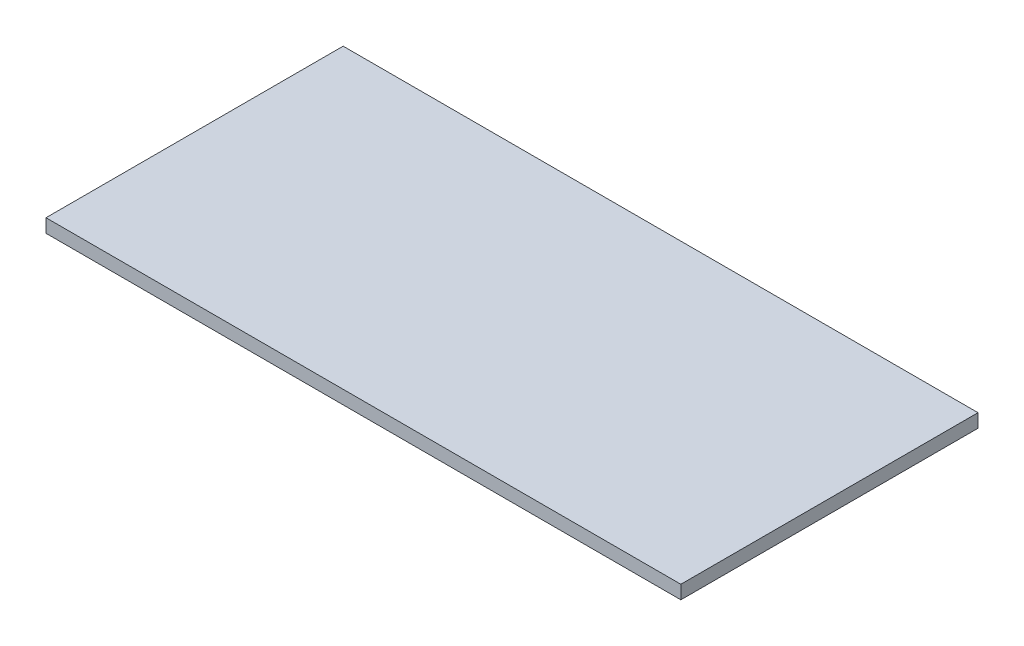
ISO-10303-21;
HEADER;
FILE_DESCRIPTION(('STEP AP214'),'2;1');
FILE_NAME('part.step','',(''),(''),'','','');
FILE_SCHEMA(('AUTOMOTIVE_DESIGN { 1 0 10303 214 1 1 1 1 }'));
ENDSEC;
DATA;
#1=APPLICATION_CONTEXT('core data for automotive mechanical design processes');
#2=APPLICATION_PROTOCOL_DEFINITION('international standard','automotive_design',2000,#1);
#3=PRODUCT_CONTEXT('',#1,'mechanical');
#4=PRODUCT('Part','Part','',(#3));
#5=PRODUCT_RELATED_PRODUCT_CATEGORY('part','',(#4));
#6=PRODUCT_DEFINITION_FORMATION('','',#4);
#7=PRODUCT_DEFINITION_CONTEXT('part definition',#1,'design');
#8=PRODUCT_DEFINITION('design','',#6,#7);
#9=PRODUCT_DEFINITION_SHAPE('','',#8);
#10=(LENGTH_UNIT() NAMED_UNIT(*) SI_UNIT(.MILLI.,.METRE.));
#11=(NAMED_UNIT(*) PLANE_ANGLE_UNIT() SI_UNIT($,.RADIAN.));
#12=(NAMED_UNIT(*) SI_UNIT($,.STERADIAN.) SOLID_ANGLE_UNIT());
#13=UNCERTAINTY_MEASURE_WITH_UNIT(LENGTH_MEASURE(1.E-05),#10,'distance_accuracy_value','');
#14=(GEOMETRIC_REPRESENTATION_CONTEXT(3) GLOBAL_UNCERTAINTY_ASSIGNED_CONTEXT((#13)) GLOBAL_UNIT_ASSIGNED_CONTEXT((#10,
#11,#12)) REPRESENTATION_CONTEXT('',''));
#15=CARTESIAN_POINT('',(0.,0.,0.));
#16=DIRECTION('',(0.,0.,1.));
#17=DIRECTION('',(1.,0.,0.));
#18=AXIS2_PLACEMENT_3D('',#15,#16,#17);
#19=CARTESIAN_POINT('',(70.5,3.,33.));
#20=DIRECTION('',(-1.,0.,0.));
#21=DIRECTION('',(0.,0.,1.));
#22=AXIS2_PLACEMENT_3D('',#19,#20,#21);
#23=PLANE('',#22);
#24=DIRECTION('',(0.,0.,-1.));
#25=VECTOR('',#24,1.);
#26=CARTESIAN_POINT('',(70.5,0.,33.));
#27=LINE('',#26,#25);
#28=CARTESIAN_POINT('',(70.5,0.,33.));
#29=VERTEX_POINT('',#28);
#30=CARTESIAN_POINT('',(70.5,0.,-33.));
#31=VERTEX_POINT('',#30);
#32=EDGE_CURVE('E97',#29,#31,#27,.T.);
#33=ORIENTED_EDGE('',*,*,#32,.T.);
#34=DIRECTION('',(0.,-1.,0.));
#35=VECTOR('',#34,1.);
#36=CARTESIAN_POINT('',(70.5,3.,-33.));
#37=LINE('',#36,#35);
#38=CARTESIAN_POINT('',(70.5,3.,-33.));
#39=VERTEX_POINT('',#38);
#40=EDGE_CURVE('E11',#39,#31,#37,.T.);
#41=ORIENTED_EDGE('',*,*,#40,.F.);
#42=DIRECTION('',(0.,0.,-1.));
#43=VECTOR('',#42,1.);
#44=CARTESIAN_POINT('',(70.5,3.,33.));
#45=LINE('',#44,#43);
#46=CARTESIAN_POINT('',(70.5,3.,33.));
#47=VERTEX_POINT('',#46);
#48=EDGE_CURVE('E85',#47,#39,#45,.T.);
#49=ORIENTED_EDGE('',*,*,#48,.F.);
#50=DIRECTION('',(0.,-1.,0.));
#51=VECTOR('',#50,1.);
#52=CARTESIAN_POINT('',(70.5,3.,33.));
#53=LINE('',#52,#51);
#54=EDGE_CURVE('E93',#47,#29,#53,.T.);
#55=ORIENTED_EDGE('',*,*,#54,.T.);
#56=EDGE_LOOP('',(#33,#41,#49,#55));
#57=FACE_BOUND('',#56,.T.);
#58=ADVANCED_FACE('F34',(#57),#23,.F.);
#59=CARTESIAN_POINT('',(-70.5,3.,-33.));
#60=DIRECTION('',(0.,0.,1.));
#61=DIRECTION('',(1.,0.,0.));
#62=AXIS2_PLACEMENT_3D('',#59,#60,#61);
#63=PLANE('',#62);
#64=DIRECTION('',(-1.,0.,0.));
#65=VECTOR('',#64,1.);
#66=CARTESIAN_POINT('',(-70.5,0.,-33.));
#67=LINE('',#66,#65);
#68=CARTESIAN_POINT('',(-70.5,0.,-33.));
#69=VERTEX_POINT('',#68);
#70=EDGE_CURVE('E89',#31,#69,#67,.T.);
#71=ORIENTED_EDGE('',*,*,#70,.T.);
#72=DIRECTION('',(0.,-1.,0.));
#73=VECTOR('',#72,1.);
#74=CARTESIAN_POINT('',(-70.5,3.,-33.));
#75=LINE('',#74,#73);
#76=CARTESIAN_POINT('',(-70.5,3.,-33.));
#77=VERTEX_POINT('',#76);
#78=EDGE_CURVE('E42',#77,#69,#75,.T.);
#79=ORIENTED_EDGE('',*,*,#78,.F.);
#80=DIRECTION('',(-1.,0.,0.));
#81=VECTOR('',#80,1.);
#82=CARTESIAN_POINT('',(-70.5,3.,-33.));
#83=LINE('',#82,#81);
#84=EDGE_CURVE('E80',#39,#77,#83,.T.);
#85=ORIENTED_EDGE('',*,*,#84,.F.);
#86=ORIENTED_EDGE('',*,*,#40,.T.);
#87=EDGE_LOOP('',(#71,#79,#85,#86));
#88=FACE_BOUND('',#87,.T.);
#89=ADVANCED_FACE('F88',(#88),#63,.F.);
#90=CARTESIAN_POINT('',(-70.5,3.,33.));
#91=DIRECTION('',(1.,0.,0.));
#92=DIRECTION('',(0.,0.,-1.));
#93=AXIS2_PLACEMENT_3D('',#90,#91,#92);
#94=PLANE('',#93);
#95=DIRECTION('',(0.,0.,1.));
#96=VECTOR('',#95,1.);
#97=CARTESIAN_POINT('',(-70.5,0.,33.));
#98=LINE('',#97,#96);
#99=CARTESIAN_POINT('',(-70.5,0.,33.));
#100=VERTEX_POINT('',#99);
#101=EDGE_CURVE('E67',#69,#100,#98,.T.);
#102=ORIENTED_EDGE('',*,*,#101,.T.);
#103=DIRECTION('',(0.,-1.,0.));
#104=VECTOR('',#103,1.);
#105=CARTESIAN_POINT('',(-70.5,3.,33.));
#106=LINE('',#105,#104);
#107=CARTESIAN_POINT('',(-70.5,3.,33.));
#108=VERTEX_POINT('',#107);
#109=EDGE_CURVE('E90',#108,#100,#106,.T.);
#110=ORIENTED_EDGE('',*,*,#109,.F.);
#111=DIRECTION('',(0.,0.,1.));
#112=VECTOR('',#111,1.);
#113=CARTESIAN_POINT('',(-70.5,3.,33.));
#114=LINE('',#113,#112);
#115=EDGE_CURVE('E83',#77,#108,#114,.T.);
#116=ORIENTED_EDGE('',*,*,#115,.F.);
#117=ORIENTED_EDGE('',*,*,#78,.T.);
#118=EDGE_LOOP('',(#102,#110,#116,#117));
#119=FACE_BOUND('',#118,.T.);
#120=ADVANCED_FACE('F91',(#119),#94,.F.);
#121=CARTESIAN_POINT('',(-70.5,3.,33.));
#122=DIRECTION('',(0.,0.,-1.));
#123=DIRECTION('',(-1.,0.,0.));
#124=AXIS2_PLACEMENT_3D('',#121,#122,#123);
#125=PLANE('',#124);
#126=DIRECTION('',(1.,0.,0.));
#127=VECTOR('',#126,1.);
#128=CARTESIAN_POINT('',(-70.5,0.,33.));
#129=LINE('',#128,#127);
#130=EDGE_CURVE('E73',#100,#29,#129,.T.);
#131=ORIENTED_EDGE('',*,*,#130,.T.);
#132=ORIENTED_EDGE('',*,*,#54,.F.);
#133=DIRECTION('',(1.,0.,0.));
#134=VECTOR('',#133,1.);
#135=CARTESIAN_POINT('',(-70.5,3.,33.));
#136=LINE('',#135,#134);
#137=EDGE_CURVE('E50',#108,#47,#136,.T.);
#138=ORIENTED_EDGE('',*,*,#137,.F.);
#139=ORIENTED_EDGE('',*,*,#109,.T.);
#140=EDGE_LOOP('',(#131,#132,#138,#139));
#141=FACE_BOUND('',#140,.T.);
#142=ADVANCED_FACE('F104',(#141),#125,.F.);
#143=CARTESIAN_POINT('',(0.,3.,0.));
#144=DIRECTION('',(0.,-1.,0.));
#145=DIRECTION('',(0.,0.,-1.));
#146=AXIS2_PLACEMENT_3D('',#143,#144,#145);
#147=PLANE('',#146);
#148=ORIENTED_EDGE('',*,*,#48,.T.);
#149=ORIENTED_EDGE('',*,*,#84,.T.);
#150=ORIENTED_EDGE('',*,*,#115,.T.);
#151=ORIENTED_EDGE('',*,*,#137,.T.);
#152=EDGE_LOOP('',(#148,#149,#150,#151));
#153=FACE_BOUND('',#152,.T.);
#154=ADVANCED_FACE('F81',(#153),#147,.F.);
#155=CARTESIAN_POINT('',(0.,0.,0.));
#156=DIRECTION('',(0.,-1.,0.));
#157=DIRECTION('',(0.,0.,-1.));
#158=AXIS2_PLACEMENT_3D('',#155,#156,#157);
#159=PLANE('',#158);
#160=ORIENTED_EDGE('',*,*,#32,.F.);
#161=ORIENTED_EDGE('',*,*,#130,.F.);
#162=ORIENTED_EDGE('',*,*,#101,.F.);
#163=ORIENTED_EDGE('',*,*,#70,.F.);
#164=EDGE_LOOP('',(#160,#161,#162,#163));
#165=FACE_BOUND('',#164,.T.);
#166=ADVANCED_FACE('F107',(#165),#159,.T.);
#167=CLOSED_SHELL('',(#58,#89,#120,#142,#154,#166));
#168=MANIFOLD_SOLID_BREP('B2',#167);
#169=ADVANCED_BREP_SHAPE_REPRESENTATION('',(#18,#168),#14);
#170=SHAPE_DEFINITION_REPRESENTATION(#9,#169);
ENDSEC;
END-ISO-10303-21;
